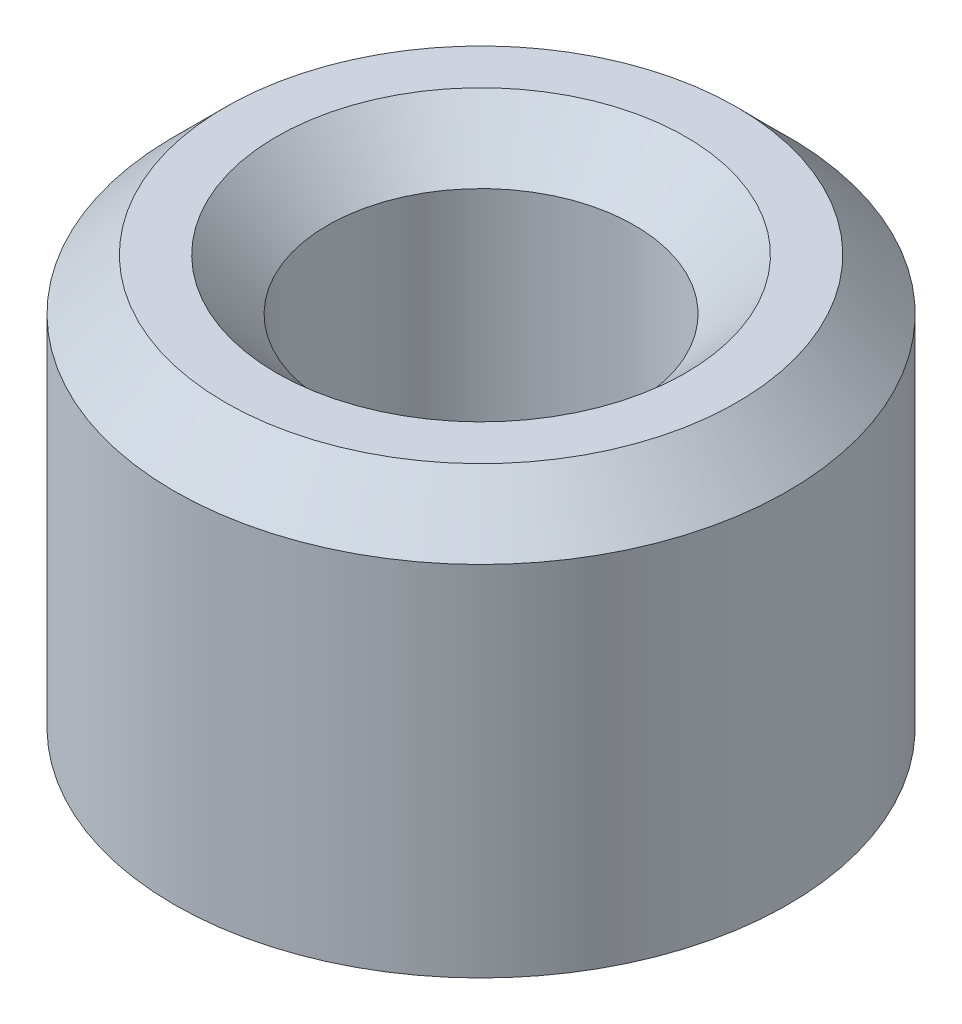
ISO-10303-21;
HEADER;
FILE_DESCRIPTION(('STEP AP214'),'2;1');
FILE_NAME('part.step','',(''),(''),'','','');
FILE_SCHEMA(('AUTOMOTIVE_DESIGN { 1 0 10303 214 1 1 1 1 }'));
ENDSEC;
DATA;
#1=APPLICATION_CONTEXT('core data for automotive mechanical design processes');
#2=APPLICATION_PROTOCOL_DEFINITION('international standard','automotive_design',2000,#1);
#3=PRODUCT_CONTEXT('',#1,'mechanical');
#4=PRODUCT('Part','Part','',(#3));
#5=PRODUCT_RELATED_PRODUCT_CATEGORY('part','',(#4));
#6=PRODUCT_DEFINITION_FORMATION('','',#4);
#7=PRODUCT_DEFINITION_CONTEXT('part definition',#1,'design');
#8=PRODUCT_DEFINITION('design','',#6,#7);
#9=PRODUCT_DEFINITION_SHAPE('','',#8);
#10=(LENGTH_UNIT() NAMED_UNIT(*) SI_UNIT(.MILLI.,.METRE.));
#11=(NAMED_UNIT(*) PLANE_ANGLE_UNIT() SI_UNIT($,.RADIAN.));
#12=(NAMED_UNIT(*) SI_UNIT($,.STERADIAN.) SOLID_ANGLE_UNIT());
#13=UNCERTAINTY_MEASURE_WITH_UNIT(LENGTH_MEASURE(1.E-05),#10,'distance_accuracy_value','');
#14=(GEOMETRIC_REPRESENTATION_CONTEXT(3) GLOBAL_UNCERTAINTY_ASSIGNED_CONTEXT((#13)) GLOBAL_UNIT_ASSIGNED_CONTEXT((#10,
#11,#12)) REPRESENTATION_CONTEXT('',''));
#15=CARTESIAN_POINT('',(0.,0.,0.));
#16=DIRECTION('',(0.,0.,1.));
#17=DIRECTION('',(1.,0.,0.));
#18=AXIS2_PLACEMENT_3D('',#15,#16,#17);
#19=CARTESIAN_POINT('',(-11.,24.7,0.));
#20=DIRECTION('',(0.,1.,0.));
#21=DIRECTION('',(1.,0.,0.));
#22=AXIS2_PLACEMENT_3D('',#19,#20,#21);
#23=PLANE('',#22);
#24=CARTESIAN_POINT('',(-11.,24.7,0.));
#25=DIRECTION('',(0.,-1.,0.));
#26=DIRECTION('',(0.,0.,1.));
#27=AXIS2_PLACEMENT_3D('',#24,#25,#26);
#28=CIRCLE('',#27,2.);
#29=CARTESIAN_POINT('',(-11.,24.7,2.));
#30=VERTEX_POINT('',#29);
#31=EDGE_CURVE('E10',#30,#30,#28,.T.);
#32=ORIENTED_EDGE('',*,*,#31,.T.);
#33=EDGE_LOOP('',(#32));
#34=FACE_BOUND('',#33,.T.);
#35=CARTESIAN_POINT('',(-11.,24.7,0.));
#36=DIRECTION('',(0.,1.,0.));
#37=DIRECTION('',(0.,0.,1.));
#38=AXIS2_PLACEMENT_3D('',#35,#36,#37);
#39=CIRCLE('',#38,2.5);
#40=CARTESIAN_POINT('',(-11.,24.7,2.5));
#41=VERTEX_POINT('',#40);
#42=EDGE_CURVE('E18',#41,#41,#39,.T.);
#43=ORIENTED_EDGE('',*,*,#42,.T.);
#44=EDGE_LOOP('',(#43));
#45=FACE_BOUND('',#44,.T.);
#46=ADVANCED_FACE('F15',(#34,#45),#23,.T.);
#47=CARTESIAN_POINT('',(-11.,20.7,0.));
#48=DIRECTION('',(0.,1.,0.));
#49=DIRECTION('',(1.,0.,0.));
#50=AXIS2_PLACEMENT_3D('',#47,#48,#49);
#51=PLANE('',#50);
#52=CARTESIAN_POINT('',(-11.,20.7,0.));
#53=DIRECTION('',(0.,1.,0.));
#54=DIRECTION('',(0.,0.,1.));
#55=AXIS2_PLACEMENT_3D('',#52,#53,#54);
#56=CIRCLE('',#55,1.5);
#57=CARTESIAN_POINT('',(-11.,20.7,1.5));
#58=VERTEX_POINT('',#57);
#59=EDGE_CURVE('E32',#58,#58,#56,.T.);
#60=ORIENTED_EDGE('',*,*,#59,.T.);
#61=EDGE_LOOP('',(#60));
#62=FACE_BOUND('',#61,.T.);
#63=CARTESIAN_POINT('',(-11.,20.7,0.));
#64=DIRECTION('',(0.,1.,0.));
#65=DIRECTION('',(0.,0.,1.));
#66=AXIS2_PLACEMENT_3D('',#63,#64,#65);
#67=CIRCLE('',#66,3.);
#68=CARTESIAN_POINT('',(-11.,20.7,3.));
#69=VERTEX_POINT('',#68);
#70=EDGE_CURVE('E34',#69,#69,#67,.T.);
#71=ORIENTED_EDGE('',*,*,#70,.F.);
#72=EDGE_LOOP('',(#71));
#73=FACE_BOUND('',#72,.T.);
#74=ADVANCED_FACE('F70',(#62,#73),#51,.F.);
#75=CARTESIAN_POINT('',(-11.,24.2,0.));
#76=DIRECTION('',(0.,1.,0.));
#77=DIRECTION('',(0.,0.,1.));
#78=AXIS2_PLACEMENT_3D('',#75,#76,#77);
#79=CONICAL_SURFACE('',#78,1.5,0.78539816339745);
#80=ORIENTED_EDGE('',*,*,#31,.F.);
#81=EDGE_LOOP('',(#80));
#82=FACE_BOUND('',#81,.T.);
#83=CARTESIAN_POINT('',(-11.,24.2,0.));
#84=DIRECTION('',(0.,1.,0.));
#85=DIRECTION('',(0.,0.,1.));
#86=AXIS2_PLACEMENT_3D('',#83,#84,#85);
#87=CIRCLE('',#86,1.5);
#88=CARTESIAN_POINT('',(-11.,24.2,1.5));
#89=VERTEX_POINT('',#88);
#90=EDGE_CURVE('E36',#89,#89,#87,.T.);
#91=ORIENTED_EDGE('',*,*,#90,.F.);
#92=EDGE_LOOP('',(#91));
#93=FACE_BOUND('',#92,.T.);
#94=ADVANCED_FACE('F65',(#82,#93),#79,.F.);
#95=CARTESIAN_POINT('',(-11.,24.7,0.));
#96=DIRECTION('',(0.,-1.,0.));
#97=DIRECTION('',(0.,0.,-1.));
#98=AXIS2_PLACEMENT_3D('',#95,#96,#97);
#99=CONICAL_SURFACE('',#98,2.5,0.785398163397446);
#100=CARTESIAN_POINT('',(-11.,24.2,0.));
#101=DIRECTION('',(0.,-1.,0.));
#102=DIRECTION('',(0.,0.,1.));
#103=AXIS2_PLACEMENT_3D('',#100,#101,#102);
#104=CIRCLE('',#103,3.);
#105=CARTESIAN_POINT('',(-11.,24.2,3.));
#106=VERTEX_POINT('',#105);
#107=EDGE_CURVE('E47',#106,#106,#104,.T.);
#108=ORIENTED_EDGE('',*,*,#107,.F.);
#109=EDGE_LOOP('',(#108));
#110=FACE_BOUND('',#109,.T.);
#111=ORIENTED_EDGE('',*,*,#42,.F.);
#112=EDGE_LOOP('',(#111));
#113=FACE_BOUND('',#112,.T.);
#114=ADVANCED_FACE('F61',(#110,#113),#99,.T.);
#115=CARTESIAN_POINT('',(-11.,24.7,0.));
#116=DIRECTION('',(0.,-1.,0.));
#117=DIRECTION('',(0.,0.,-1.));
#118=AXIS2_PLACEMENT_3D('',#115,#116,#117);
#119=CYLINDRICAL_SURFACE('',#118,1.5);
#120=ORIENTED_EDGE('',*,*,#59,.F.);
#121=EDGE_LOOP('',(#120));
#122=FACE_BOUND('',#121,.T.);
#123=ORIENTED_EDGE('',*,*,#90,.T.);
#124=EDGE_LOOP('',(#123));
#125=FACE_BOUND('',#124,.T.);
#126=ADVANCED_FACE('F64',(#122,#125),#119,.F.);
#127=CARTESIAN_POINT('',(-11.,24.7,0.));
#128=DIRECTION('',(0.,-1.,0.));
#129=DIRECTION('',(0.,0.,-1.));
#130=AXIS2_PLACEMENT_3D('',#127,#128,#129);
#131=CYLINDRICAL_SURFACE('',#130,3.);
#132=ORIENTED_EDGE('',*,*,#70,.T.);
#133=EDGE_LOOP('',(#132));
#134=FACE_BOUND('',#133,.T.);
#135=ORIENTED_EDGE('',*,*,#107,.T.);
#136=EDGE_LOOP('',(#135));
#137=FACE_BOUND('',#136,.T.);
#138=ADVANCED_FACE('F59',(#134,#137),#131,.T.);
#139=CLOSED_SHELL('',(#46,#74,#94,#114,#126,#138));
#140=MANIFOLD_SOLID_BREP('B1',#139);
#141=ADVANCED_BREP_SHAPE_REPRESENTATION('',(#18,#140),#14);
#142=SHAPE_DEFINITION_REPRESENTATION(#9,#141);
ENDSEC;
END-ISO-10303-21;
